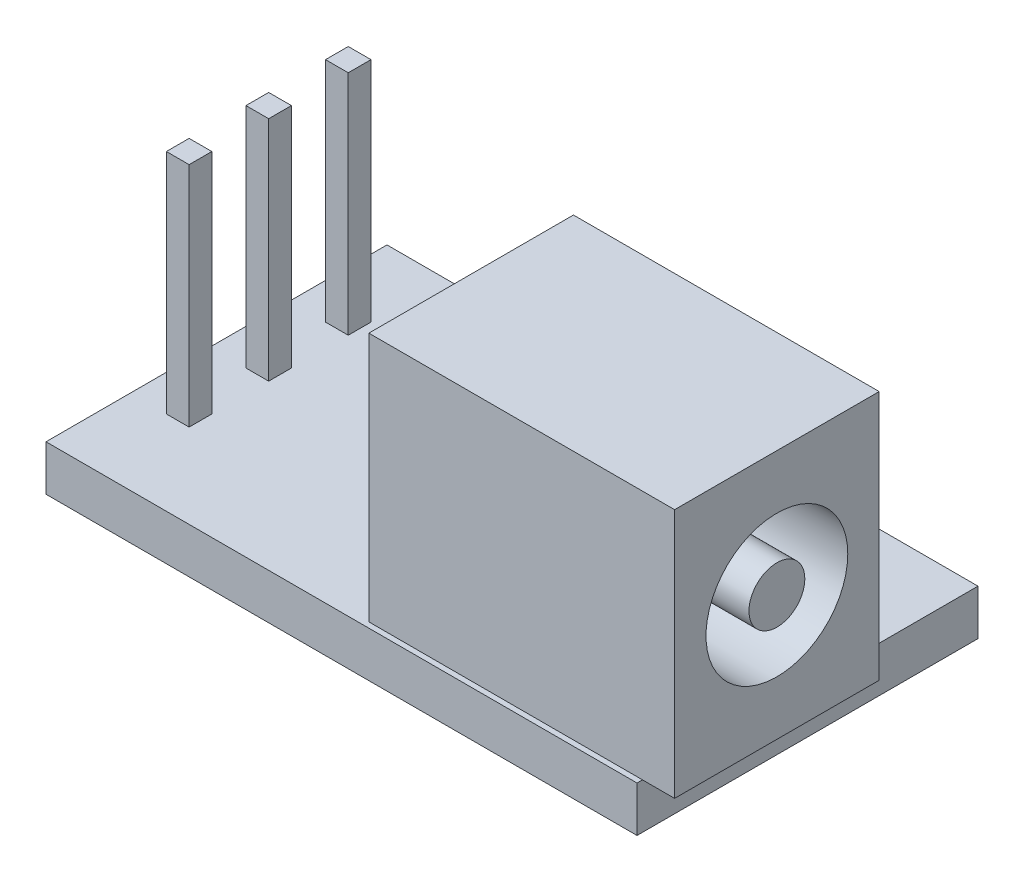
ISO-10303-21;
HEADER;
FILE_DESCRIPTION(('STEP AP214'),'2;1');
FILE_NAME('part.step','',(''),(''),'','','');
FILE_SCHEMA(('AUTOMOTIVE_DESIGN { 1 0 10303 214 1 1 1 1 }'));
ENDSEC;
DATA;
#1=APPLICATION_CONTEXT('core data for automotive mechanical design processes');
#2=APPLICATION_PROTOCOL_DEFINITION('international standard','automotive_design',2000,#1);
#3=PRODUCT_CONTEXT('',#1,'mechanical');
#4=PRODUCT('Part','Part','',(#3));
#5=PRODUCT_RELATED_PRODUCT_CATEGORY('part','',(#4));
#6=PRODUCT_DEFINITION_FORMATION('','',#4);
#7=PRODUCT_DEFINITION_CONTEXT('part definition',#1,'design');
#8=PRODUCT_DEFINITION('design','',#6,#7);
#9=PRODUCT_DEFINITION_SHAPE('','',#8);
#10=(LENGTH_UNIT() NAMED_UNIT(*) SI_UNIT(.MILLI.,.METRE.));
#11=(NAMED_UNIT(*) PLANE_ANGLE_UNIT() SI_UNIT($,.RADIAN.));
#12=(NAMED_UNIT(*) SI_UNIT($,.STERADIAN.) SOLID_ANGLE_UNIT());
#13=UNCERTAINTY_MEASURE_WITH_UNIT(LENGTH_MEASURE(1.E-05),#10,'distance_accuracy_value','');
#14=(GEOMETRIC_REPRESENTATION_CONTEXT(3) GLOBAL_UNCERTAINTY_ASSIGNED_CONTEXT((#13)) GLOBAL_UNIT_ASSIGNED_CONTEXT((#10,
#11,#12)) REPRESENTATION_CONTEXT('',''));
#15=CARTESIAN_POINT('',(0.,0.,0.));
#16=DIRECTION('',(0.,0.,1.));
#17=DIRECTION('',(1.,0.,0.));
#18=AXIS2_PLACEMENT_3D('',#15,#16,#17);
#19=CARTESIAN_POINT('',(0.,2.,0.));
#20=DIRECTION('',(0.,1.,0.));
#21=DIRECTION('',(0.,0.,1.));
#22=AXIS2_PLACEMENT_3D('',#19,#20,#21);
#23=PLANE('',#22);
#24=CARTESIAN_POINT('',(-4.,2.,0.));
#25=DIRECTION('',(0.,1.,0.));
#26=DIRECTION('',(0.,0.,1.));
#27=AXIS2_PLACEMENT_3D('',#24,#25,#26);
#28=CIRCLE('',#27,1.5);
#29=CARTESIAN_POINT('',(-4.,2.,1.5));
#30=VERTEX_POINT('',#29);
#31=EDGE_CURVE('E267',#30,#30,#28,.T.);
#32=ORIENTED_EDGE('',*,*,#31,.F.);
#33=EDGE_LOOP('',(#32));
#34=FACE_BOUND('',#33,.T.);
#35=DIRECTION('',(-1.,0.,0.));
#36=VECTOR('',#35,1.);
#37=CARTESIAN_POINT('',(0.962638708128508,2.,-1.74009974286417));
#38=LINE('',#37,#36);
#39=CARTESIAN_POINT('',(13.,2.,-1.74009974286417));
#40=VERTEX_POINT('',#39);
#41=CARTESIAN_POINT('',(0.962638708128508,2.,-1.74009974286417));
#42=VERTEX_POINT('',#41);
#43=EDGE_CURVE('E11',#40,#42,#38,.T.);
#44=ORIENTED_EDGE('',*,*,#43,.F.);
#45=DIRECTION('',(0.,0.,-1.));
#46=VECTOR('',#45,1.);
#47=CARTESIAN_POINT('',(13.,2.,-7.5));
#48=LINE('',#47,#46);
#49=CARTESIAN_POINT('',(13.,2.,-7.5));
#50=VERTEX_POINT('',#49);
#51=EDGE_CURVE('E306',#40,#50,#48,.T.);
#52=ORIENTED_EDGE('',*,*,#51,.T.);
#53=DIRECTION('',(-1.,0.,0.));
#54=VECTOR('',#53,1.);
#55=CARTESIAN_POINT('',(-13.,2.,-7.5));
#56=LINE('',#55,#54);
#57=CARTESIAN_POINT('',(-13.,2.,-7.5));
#58=VERTEX_POINT('',#57);
#59=EDGE_CURVE('E304',#50,#58,#56,.T.);
#60=ORIENTED_EDGE('',*,*,#59,.T.);
#61=DIRECTION('',(0.,0.,1.));
#62=VECTOR('',#61,1.);
#63=CARTESIAN_POINT('',(-13.,2.,-7.5));
#64=LINE('',#63,#62);
#65=CARTESIAN_POINT('',(-13.,2.,7.5));
#66=VERTEX_POINT('',#65);
#67=EDGE_CURVE('E308',#58,#66,#64,.T.);
#68=ORIENTED_EDGE('',*,*,#67,.T.);
#69=DIRECTION('',(1.,0.,0.));
#70=VECTOR('',#69,1.);
#71=CARTESIAN_POINT('',(-13.,2.,7.5));
#72=LINE('',#71,#70);
#73=CARTESIAN_POINT('',(13.,2.,7.5));
#74=VERTEX_POINT('',#73);
#75=EDGE_CURVE('E310',#66,#74,#72,.T.);
#76=ORIENTED_EDGE('',*,*,#75,.T.);
#77=CARTESIAN_POINT('',(13.,2.,7.25990025713583));
#78=VERTEX_POINT('',#77);
#79=EDGE_CURVE('E302',#74,#78,#48,.T.);
#80=ORIENTED_EDGE('',*,*,#79,.T.);
#81=DIRECTION('',(1.,0.,0.));
#82=VECTOR('',#81,1.);
#83=CARTESIAN_POINT('',(0.962638708128509,2.,7.25990025713583));
#84=LINE('',#83,#82);
#85=CARTESIAN_POINT('',(0.962638708128509,2.,7.25990025713583));
#86=VERTEX_POINT('',#85);
#87=EDGE_CURVE('E284',#86,#78,#84,.T.);
#88=ORIENTED_EDGE('',*,*,#87,.F.);
#89=DIRECTION('',(0.,0.,1.));
#90=VECTOR('',#89,1.);
#91=CARTESIAN_POINT('',(0.962638708128508,2.,-1.74009974286417));
#92=LINE('',#91,#90);
#93=EDGE_CURVE('E280',#42,#86,#92,.T.);
#94=ORIENTED_EDGE('',*,*,#93,.F.);
#95=EDGE_LOOP('',(#44,#52,#60,#68,#76,#80,#88,#94));
#96=FACE_BOUND('',#95,.T.);
#97=DIRECTION('',(1.,0.,0.));
#98=VECTOR('',#97,1.);
#99=CARTESIAN_POINT('',(-11.4105633532802,2.,3.79339200262052));
#100=LINE('',#99,#98);
#101=CARTESIAN_POINT('',(-11.4105633532802,2.,3.79339200262052));
#102=VERTEX_POINT('',#101);
#103=CARTESIAN_POINT('',(-10.4105633532802,2.,3.79339200262052));
#104=VERTEX_POINT('',#103);
#105=EDGE_CURVE('E252',#102,#104,#100,.T.);
#106=ORIENTED_EDGE('',*,*,#105,.F.);
#107=DIRECTION('',(0.,0.,1.));
#108=VECTOR('',#107,1.);
#109=CARTESIAN_POINT('',(-11.4105633532802,2.,3.79339200262052));
#110=LINE('',#109,#108);
#111=CARTESIAN_POINT('',(-11.4105633532802,2.,2.79339200262052));
#112=VERTEX_POINT('',#111);
#113=EDGE_CURVE('E238',#112,#102,#110,.T.);
#114=ORIENTED_EDGE('',*,*,#113,.F.);
#115=DIRECTION('',(-1.,0.,0.));
#116=VECTOR('',#115,1.);
#117=CARTESIAN_POINT('',(-11.4105633532802,2.,2.79339200262052));
#118=LINE('',#117,#116);
#119=CARTESIAN_POINT('',(-10.4105633532802,2.,2.79339200262052));
#120=VERTEX_POINT('',#119);
#121=EDGE_CURVE('E243',#120,#112,#118,.T.);
#122=ORIENTED_EDGE('',*,*,#121,.F.);
#123=DIRECTION('',(0.,0.,-1.));
#124=VECTOR('',#123,1.);
#125=CARTESIAN_POINT('',(-10.4105633532802,2.,3.79339200262052));
#126=LINE('',#125,#124);
#127=EDGE_CURVE('E254',#104,#120,#126,.T.);
#128=ORIENTED_EDGE('',*,*,#127,.F.);
#129=EDGE_LOOP('',(#106,#114,#122,#128));
#130=FACE_BOUND('',#129,.T.);
#131=DIRECTION('',(1.,0.,0.));
#132=VECTOR('',#131,1.);
#133=CARTESIAN_POINT('',(-11.4105633532802,2.,0.293392002620521));
#134=LINE('',#133,#132);
#135=CARTESIAN_POINT('',(-11.4105633532802,2.,0.293392002620521));
#136=VERTEX_POINT('',#135);
#137=CARTESIAN_POINT('',(-10.4105633532802,2.,0.293392002620521));
#138=VERTEX_POINT('',#137);
#139=EDGE_CURVE('E210',#136,#138,#134,.T.);
#140=ORIENTED_EDGE('',*,*,#139,.F.);
#141=DIRECTION('',(0.,0.,1.));
#142=VECTOR('',#141,1.);
#143=CARTESIAN_POINT('',(-11.4105633532802,2.,0.293392002620521));
#144=LINE('',#143,#142);
#145=CARTESIAN_POINT('',(-11.4105633532802,2.,-0.70660799737948));
#146=VERTEX_POINT('',#145);
#147=EDGE_CURVE('E207',#146,#136,#144,.T.);
#148=ORIENTED_EDGE('',*,*,#147,.F.);
#149=DIRECTION('',(-1.,0.,0.));
#150=VECTOR('',#149,1.);
#151=CARTESIAN_POINT('',(-11.4105633532802,2.,-0.70660799737948));
#152=LINE('',#151,#150);
#153=CARTESIAN_POINT('',(-10.4105633532802,2.,-0.70660799737948));
#154=VERTEX_POINT('',#153);
#155=EDGE_CURVE('E219',#154,#146,#152,.T.);
#156=ORIENTED_EDGE('',*,*,#155,.F.);
#157=DIRECTION('',(0.,0.,-1.));
#158=VECTOR('',#157,1.);
#159=CARTESIAN_POINT('',(-10.4105633532802,2.,0.293392002620521));
#160=LINE('',#159,#158);
#161=EDGE_CURVE('E227',#138,#154,#160,.T.);
#162=ORIENTED_EDGE('',*,*,#161,.F.);
#163=EDGE_LOOP('',(#140,#148,#156,#162));
#164=FACE_BOUND('',#163,.T.);
#165=DIRECTION('',(1.,0.,0.));
#166=VECTOR('',#165,1.);
#167=CARTESIAN_POINT('',(-11.4105633532802,2.,-3.20660799737948));
#168=LINE('',#167,#166);
#169=CARTESIAN_POINT('',(-11.4105633532802,2.,-3.20660799737948));
#170=VERTEX_POINT('',#169);
#171=CARTESIAN_POINT('',(-10.4105633532802,2.,-3.20660799737948));
#172=VERTEX_POINT('',#171);
#173=EDGE_CURVE('E651',#170,#172,#168,.T.);
#174=ORIENTED_EDGE('',*,*,#173,.F.);
#175=DIRECTION('',(0.,0.,1.));
#176=VECTOR('',#175,1.);
#177=CARTESIAN_POINT('',(-11.4105633532802,2.,-3.20660799737948));
#178=LINE('',#177,#176);
#179=CARTESIAN_POINT('',(-11.4105633532802,2.,-4.20660799737948));
#180=VERTEX_POINT('',#179);
#181=EDGE_CURVE('E205',#180,#170,#178,.T.);
#182=ORIENTED_EDGE('',*,*,#181,.F.);
#183=DIRECTION('',(-1.,0.,0.));
#184=VECTOR('',#183,1.);
#185=CARTESIAN_POINT('',(-11.4105633532802,2.,-4.20660799737948));
#186=LINE('',#185,#184);
#187=CARTESIAN_POINT('',(-10.4105633532802,2.,-4.20660799737948));
#188=VERTEX_POINT('',#187);
#189=EDGE_CURVE('E201',#188,#180,#186,.T.);
#190=ORIENTED_EDGE('',*,*,#189,.F.);
#191=DIRECTION('',(0.,0.,-1.));
#192=VECTOR('',#191,1.);
#193=CARTESIAN_POINT('',(-10.4105633532802,2.,-3.20660799737948));
#194=LINE('',#193,#192);
#195=EDGE_CURVE('E653',#172,#188,#194,.T.);
#196=ORIENTED_EDGE('',*,*,#195,.F.);
#197=EDGE_LOOP('',(#174,#182,#190,#196));
#198=FACE_BOUND('',#197,.T.);
#199=ADVANCED_FACE('F35',(#34,#96,#130,#164,#198),#23,.T.);
#200=CARTESIAN_POINT('',(13.,2.,-7.5));
#201=DIRECTION('',(-1.,0.,0.));
#202=DIRECTION('',(0.,0.,1.));
#203=AXIS2_PLACEMENT_3D('',#200,#201,#202);
#204=PLANE('',#203);
#205=DIRECTION('',(0.,0.,-1.));
#206=VECTOR('',#205,1.);
#207=CARTESIAN_POINT('',(13.,0.,-7.5));
#208=LINE('',#207,#206);
#209=CARTESIAN_POINT('',(13.,0.,7.5));
#210=VERTEX_POINT('',#209);
#211=CARTESIAN_POINT('',(13.,0.,-7.5));
#212=VERTEX_POINT('',#211);
#213=EDGE_CURVE('E301',#210,#212,#208,.T.);
#214=ORIENTED_EDGE('',*,*,#213,.T.);
#215=DIRECTION('',(0.,-1.,0.));
#216=VECTOR('',#215,1.);
#217=CARTESIAN_POINT('',(13.,2.,-7.5));
#218=LINE('',#217,#216);
#219=EDGE_CURVE('E44',#50,#212,#218,.T.);
#220=ORIENTED_EDGE('',*,*,#219,.F.);
#221=ORIENTED_EDGE('',*,*,#51,.F.);
#222=EDGE_CURVE('E305',#78,#40,#48,.T.);
#223=ORIENTED_EDGE('',*,*,#222,.F.);
#224=ORIENTED_EDGE('',*,*,#79,.F.);
#225=DIRECTION('',(0.,-1.,0.));
#226=VECTOR('',#225,1.);
#227=CARTESIAN_POINT('',(13.,2.,7.5));
#228=LINE('',#227,#226);
#229=EDGE_CURVE('E312',#74,#210,#228,.T.);
#230=ORIENTED_EDGE('',*,*,#229,.T.);
#231=EDGE_LOOP('',(#214,#220,#221,#223,#224,#230));
#232=FACE_BOUND('',#231,.T.);
#233=ADVANCED_FACE('F37',(#232),#204,.F.);
#234=CARTESIAN_POINT('',(-13.,2.,-7.5));
#235=DIRECTION('',(0.,0.,1.));
#236=DIRECTION('',(1.,0.,0.));
#237=AXIS2_PLACEMENT_3D('',#234,#235,#236);
#238=PLANE('',#237);
#239=DIRECTION('',(-1.,0.,0.));
#240=VECTOR('',#239,1.);
#241=CARTESIAN_POINT('',(-13.,0.,-7.5));
#242=LINE('',#241,#240);
#243=CARTESIAN_POINT('',(-13.,0.,-7.5));
#244=VERTEX_POINT('',#243);
#245=EDGE_CURVE('E315',#212,#244,#242,.T.);
#246=ORIENTED_EDGE('',*,*,#245,.T.);
#247=DIRECTION('',(0.,-1.,0.));
#248=VECTOR('',#247,1.);
#249=CARTESIAN_POINT('',(-13.,2.,-7.5));
#250=LINE('',#249,#248);
#251=EDGE_CURVE('E326',#58,#244,#250,.T.);
#252=ORIENTED_EDGE('',*,*,#251,.F.);
#253=ORIENTED_EDGE('',*,*,#59,.F.);
#254=ORIENTED_EDGE('',*,*,#219,.T.);
#255=EDGE_LOOP('',(#246,#252,#253,#254));
#256=FACE_BOUND('',#255,.T.);
#257=ADVANCED_FACE('F332',(#256),#238,.F.);
#258=CARTESIAN_POINT('',(-13.,2.,-7.5));
#259=DIRECTION('',(1.,0.,0.));
#260=DIRECTION('',(0.,0.,-1.));
#261=AXIS2_PLACEMENT_3D('',#258,#259,#260);
#262=PLANE('',#261);
#263=DIRECTION('',(0.,0.,1.));
#264=VECTOR('',#263,1.);
#265=CARTESIAN_POINT('',(-13.,0.,-7.5));
#266=LINE('',#265,#264);
#267=CARTESIAN_POINT('',(-13.,0.,7.5));
#268=VERTEX_POINT('',#267);
#269=EDGE_CURVE('E317',#244,#268,#266,.T.);
#270=ORIENTED_EDGE('',*,*,#269,.T.);
#271=DIRECTION('',(0.,-1.,0.));
#272=VECTOR('',#271,1.);
#273=CARTESIAN_POINT('',(-13.,2.,7.5));
#274=LINE('',#273,#272);
#275=EDGE_CURVE('E323',#66,#268,#274,.T.);
#276=ORIENTED_EDGE('',*,*,#275,.F.);
#277=ORIENTED_EDGE('',*,*,#67,.F.);
#278=ORIENTED_EDGE('',*,*,#251,.T.);
#279=EDGE_LOOP('',(#270,#276,#277,#278));
#280=FACE_BOUND('',#279,.T.);
#281=ADVANCED_FACE('F345',(#280),#262,.F.);
#282=CARTESIAN_POINT('',(-13.,2.,7.5));
#283=DIRECTION('',(0.,0.,-1.));
#284=DIRECTION('',(-1.,0.,0.));
#285=AXIS2_PLACEMENT_3D('',#282,#283,#284);
#286=PLANE('',#285);
#287=DIRECTION('',(1.,0.,0.));
#288=VECTOR('',#287,1.);
#289=CARTESIAN_POINT('',(-13.,0.,7.5));
#290=LINE('',#289,#288);
#291=EDGE_CURVE('E319',#268,#210,#290,.T.);
#292=ORIENTED_EDGE('',*,*,#291,.T.);
#293=ORIENTED_EDGE('',*,*,#229,.F.);
#294=ORIENTED_EDGE('',*,*,#75,.F.);
#295=ORIENTED_EDGE('',*,*,#275,.T.);
#296=EDGE_LOOP('',(#292,#293,#294,#295));
#297=FACE_BOUND('',#296,.T.);
#298=ADVANCED_FACE('F349',(#297),#286,.F.);
#299=CARTESIAN_POINT('',(0.,0.,0.));
#300=DIRECTION('',(0.,1.,0.));
#301=DIRECTION('',(0.,0.,1.));
#302=AXIS2_PLACEMENT_3D('',#299,#300,#301);
#303=PLANE('',#302);
#304=CARTESIAN_POINT('',(-4.,0.,0.));
#305=DIRECTION('',(0.,1.,0.));
#306=DIRECTION('',(0.,0.,1.));
#307=AXIS2_PLACEMENT_3D('',#304,#305,#306);
#308=CIRCLE('',#307,1.5);
#309=CARTESIAN_POINT('',(-4.,0.,1.5));
#310=VERTEX_POINT('',#309);
#311=EDGE_CURVE('E39',#310,#310,#308,.T.);
#312=ORIENTED_EDGE('',*,*,#311,.T.);
#313=EDGE_LOOP('',(#312));
#314=FACE_BOUND('',#313,.T.);
#315=ORIENTED_EDGE('',*,*,#213,.F.);
#316=ORIENTED_EDGE('',*,*,#291,.F.);
#317=ORIENTED_EDGE('',*,*,#269,.F.);
#318=ORIENTED_EDGE('',*,*,#245,.F.);
#319=EDGE_LOOP('',(#315,#316,#317,#318));
#320=FACE_BOUND('',#319,.T.);
#321=ADVANCED_FACE('F341',(#314,#320),#303,.F.);
#322=CARTESIAN_POINT('',(0.,2.,0.));
#323=DIRECTION('',(0.,1.,0.));
#324=DIRECTION('',(0.,0.,1.));
#325=AXIS2_PLACEMENT_3D('',#322,#323,#324);
#326=PLANE('',#325);
#327=CARTESIAN_POINT('',(14.4128406578129,2.,7.25990025713583));
#328=VERTEX_POINT('',#327);
#329=EDGE_CURVE('E283',#78,#328,#84,.T.);
#330=ORIENTED_EDGE('',*,*,#329,.F.);
#331=ORIENTED_EDGE('',*,*,#222,.T.);
#332=CARTESIAN_POINT('',(14.4128406578129,2.,-1.74009974286417));
#333=VERTEX_POINT('',#332);
#334=EDGE_CURVE('E46',#333,#40,#38,.T.);
#335=ORIENTED_EDGE('',*,*,#334,.F.);
#336=DIRECTION('',(0.,0.,-1.));
#337=VECTOR('',#336,1.);
#338=CARTESIAN_POINT('',(14.4128406578129,2.,-1.74009974286417));
#339=LINE('',#338,#337);
#340=EDGE_CURVE('E287',#328,#333,#339,.T.);
#341=ORIENTED_EDGE('',*,*,#340,.F.);
#342=EDGE_LOOP('',(#330,#331,#335,#341));
#343=FACE_BOUND('',#342,.T.);
#344=ADVANCED_FACE('F357',(#343),#326,.F.);
#345=CARTESIAN_POINT('',(0.962638708128508,13.,-1.74009974286417));
#346=DIRECTION('',(1.,0.,0.));
#347=DIRECTION('',(0.,0.,-1.));
#348=AXIS2_PLACEMENT_3D('',#345,#346,#347);
#349=PLANE('',#348);
#350=ORIENTED_EDGE('',*,*,#93,.T.);
#351=DIRECTION('',(0.,-1.,0.));
#352=VECTOR('',#351,1.);
#353=CARTESIAN_POINT('',(0.962638708128509,13.,7.25990025713583));
#354=LINE('',#353,#352);
#355=CARTESIAN_POINT('',(0.962638708128509,13.,7.25990025713583));
#356=VERTEX_POINT('',#355);
#357=EDGE_CURVE('E298',#356,#86,#354,.T.);
#358=ORIENTED_EDGE('',*,*,#357,.F.);
#359=DIRECTION('',(0.,0.,1.));
#360=VECTOR('',#359,1.);
#361=CARTESIAN_POINT('',(0.962638708128508,13.,-1.74009974286417));
#362=LINE('',#361,#360);
#363=CARTESIAN_POINT('',(0.962638708128508,13.,-1.74009974286417));
#364=VERTEX_POINT('',#363);
#365=EDGE_CURVE('E270',#364,#356,#362,.T.);
#366=ORIENTED_EDGE('',*,*,#365,.F.);
#367=DIRECTION('',(0.,-1.,0.));
#368=VECTOR('',#367,1.);
#369=CARTESIAN_POINT('',(0.962638708128508,13.,-1.74009974286417));
#370=LINE('',#369,#368);
#371=EDGE_CURVE('E279',#364,#42,#370,.T.);
#372=ORIENTED_EDGE('',*,*,#371,.T.);
#373=EDGE_LOOP('',(#350,#358,#366,#372));
#374=FACE_BOUND('',#373,.T.);
#375=ADVANCED_FACE('F372',(#374),#349,.F.);
#376=CARTESIAN_POINT('',(0.962638708128509,13.,7.25990025713583));
#377=DIRECTION('',(0.,0.,-1.));
#378=DIRECTION('',(-1.,0.,0.));
#379=AXIS2_PLACEMENT_3D('',#376,#377,#378);
#380=PLANE('',#379);
#381=ORIENTED_EDGE('',*,*,#87,.T.);
#382=ORIENTED_EDGE('',*,*,#329,.T.);
#383=DIRECTION('',(0.,-1.,0.));
#384=VECTOR('',#383,1.);
#385=CARTESIAN_POINT('',(14.4128406578129,13.,7.25990025713583));
#386=LINE('',#385,#384);
#387=CARTESIAN_POINT('',(14.4128406578129,13.,7.25990025713583));
#388=VERTEX_POINT('',#387);
#389=EDGE_CURVE('E295',#388,#328,#386,.T.);
#390=ORIENTED_EDGE('',*,*,#389,.F.);
#391=DIRECTION('',(1.,0.,0.));
#392=VECTOR('',#391,1.);
#393=CARTESIAN_POINT('',(0.962638708128509,13.,7.25990025713583));
#394=LINE('',#393,#392);
#395=EDGE_CURVE('E273',#356,#388,#394,.T.);
#396=ORIENTED_EDGE('',*,*,#395,.F.);
#397=ORIENTED_EDGE('',*,*,#357,.T.);
#398=EDGE_LOOP('',(#381,#382,#390,#396,#397));
#399=FACE_BOUND('',#398,.T.);
#400=ADVANCED_FACE('F369',(#399),#380,.F.);
#401=CARTESIAN_POINT('',(14.4128406578129,13.,-1.74009974286417));
#402=DIRECTION('',(-1.,0.,0.));
#403=DIRECTION('',(0.,0.,1.));
#404=AXIS2_PLACEMENT_3D('',#401,#402,#403);
#405=PLANE('',#404);
#406=CARTESIAN_POINT('',(14.4128406578129,7.5,2.75990025713583));
#407=DIRECTION('',(1.,0.,0.));
#408=DIRECTION('',(0.,0.,-1.));
#409=AXIS2_PLACEMENT_3D('',#406,#407,#408);
#410=CIRCLE('',#409,3.11835521317221);
#411=CARTESIAN_POINT('',(14.4128406578129,7.5,-0.35845495603638));
#412=VERTEX_POINT('',#411);
#413=EDGE_CURVE('E639',#412,#412,#410,.T.);
#414=ORIENTED_EDGE('',*,*,#413,.F.);
#415=EDGE_LOOP('',(#414));
#416=FACE_BOUND('',#415,.T.);
#417=ORIENTED_EDGE('',*,*,#340,.T.);
#418=DIRECTION('',(0.,-1.,0.));
#419=VECTOR('',#418,1.);
#420=CARTESIAN_POINT('',(14.4128406578129,13.,-1.74009974286417));
#421=LINE('',#420,#419);
#422=CARTESIAN_POINT('',(14.4128406578129,13.,-1.74009974286417));
#423=VERTEX_POINT('',#422);
#424=EDGE_CURVE('E292',#423,#333,#421,.T.);
#425=ORIENTED_EDGE('',*,*,#424,.F.);
#426=DIRECTION('',(0.,0.,-1.));
#427=VECTOR('',#426,1.);
#428=CARTESIAN_POINT('',(14.4128406578129,13.,-1.74009974286417));
#429=LINE('',#428,#427);
#430=EDGE_CURVE('E275',#388,#423,#429,.T.);
#431=ORIENTED_EDGE('',*,*,#430,.F.);
#432=ORIENTED_EDGE('',*,*,#389,.T.);
#433=EDGE_LOOP('',(#417,#425,#431,#432));
#434=FACE_BOUND('',#433,.T.);
#435=ADVANCED_FACE('F366',(#416,#434),#405,.F.);
#436=CARTESIAN_POINT('',(0.962638708128508,13.,-1.74009974286417));
#437=DIRECTION('',(0.,0.,1.));
#438=DIRECTION('',(1.,0.,0.));
#439=AXIS2_PLACEMENT_3D('',#436,#437,#438);
#440=PLANE('',#439);
#441=ORIENTED_EDGE('',*,*,#334,.T.);
#442=ORIENTED_EDGE('',*,*,#43,.T.);
#443=ORIENTED_EDGE('',*,*,#371,.F.);
#444=DIRECTION('',(-1.,0.,0.));
#445=VECTOR('',#444,1.);
#446=CARTESIAN_POINT('',(0.962638708128508,13.,-1.74009974286417));
#447=LINE('',#446,#445);
#448=EDGE_CURVE('E277',#423,#364,#447,.T.);
#449=ORIENTED_EDGE('',*,*,#448,.F.);
#450=ORIENTED_EDGE('',*,*,#424,.T.);
#451=EDGE_LOOP('',(#441,#442,#443,#449,#450));
#452=FACE_BOUND('',#451,.T.);
#453=ADVANCED_FACE('F360',(#452),#440,.F.);
#454=CARTESIAN_POINT('',(0.,13.,0.));
#455=DIRECTION('',(0.,1.,0.));
#456=DIRECTION('',(0.,0.,1.));
#457=AXIS2_PLACEMENT_3D('',#454,#455,#456);
#458=PLANE('',#457);
#459=ORIENTED_EDGE('',*,*,#365,.T.);
#460=ORIENTED_EDGE('',*,*,#395,.T.);
#461=ORIENTED_EDGE('',*,*,#430,.T.);
#462=ORIENTED_EDGE('',*,*,#448,.T.);
#463=EDGE_LOOP('',(#459,#460,#461,#462));
#464=FACE_BOUND('',#463,.T.);
#465=ADVANCED_FACE('F375',(#464),#458,.T.);
#466=CARTESIAN_POINT('',(-4.,-9.,0.));
#467=DIRECTION('',(0.,1.,0.));
#468=DIRECTION('',(0.,0.,1.));
#469=AXIS2_PLACEMENT_3D('',#466,#467,#468);
#470=CYLINDRICAL_SURFACE('',#469,1.5);
#471=ORIENTED_EDGE('',*,*,#31,.T.);
#472=EDGE_LOOP('',(#471));
#473=FACE_BOUND('',#472,.T.);
#474=ORIENTED_EDGE('',*,*,#311,.F.);
#475=EDGE_LOOP('',(#474));
#476=FACE_BOUND('',#475,.T.);
#477=ADVANCED_FACE('F377',(#473,#476),#470,.F.);
#478=CARTESIAN_POINT('',(-11.4105633532802,12.,3.79339200262052));
#479=DIRECTION('',(1.,0.,0.));
#480=DIRECTION('',(0.,0.,-1.));
#481=AXIS2_PLACEMENT_3D('',#478,#479,#480);
#482=PLANE('',#481);
#483=ORIENTED_EDGE('',*,*,#113,.T.);
#484=DIRECTION('',(0.,-1.,0.));
#485=VECTOR('',#484,1.);
#486=CARTESIAN_POINT('',(-11.4105633532802,12.,3.79339200262052));
#487=LINE('',#486,#485);
#488=CARTESIAN_POINT('',(-11.4105633532802,12.,3.79339200262052));
#489=VERTEX_POINT('',#488);
#490=EDGE_CURVE('E265',#489,#102,#487,.T.);
#491=ORIENTED_EDGE('',*,*,#490,.F.);
#492=DIRECTION('',(0.,0.,1.));
#493=VECTOR('',#492,1.);
#494=CARTESIAN_POINT('',(-11.4105633532802,12.,3.79339200262052));
#495=LINE('',#494,#493);
#496=CARTESIAN_POINT('',(-11.4105633532802,12.,2.79339200262052));
#497=VERTEX_POINT('',#496);
#498=EDGE_CURVE('E239',#497,#489,#495,.T.);
#499=ORIENTED_EDGE('',*,*,#498,.F.);
#500=DIRECTION('',(0.,-1.,0.));
#501=VECTOR('',#500,1.);
#502=CARTESIAN_POINT('',(-11.4105633532802,12.,2.79339200262052));
#503=LINE('',#502,#501);
#504=EDGE_CURVE('E249',#497,#112,#503,.T.);
#505=ORIENTED_EDGE('',*,*,#504,.T.);
#506=EDGE_LOOP('',(#483,#491,#499,#505));
#507=FACE_BOUND('',#506,.T.);
#508=ADVANCED_FACE('F383',(#507),#482,.F.);
#509=CARTESIAN_POINT('',(-11.4105633532802,12.,3.79339200262052));
#510=DIRECTION('',(0.,0.,-1.));
#511=DIRECTION('',(-1.,0.,0.));
#512=AXIS2_PLACEMENT_3D('',#509,#510,#511);
#513=PLANE('',#512);
#514=ORIENTED_EDGE('',*,*,#105,.T.);
#515=DIRECTION('',(0.,-1.,0.));
#516=VECTOR('',#515,1.);
#517=CARTESIAN_POINT('',(-10.4105633532802,12.,3.79339200262052));
#518=LINE('',#517,#516);
#519=CARTESIAN_POINT('',(-10.4105633532802,12.,3.79339200262052));
#520=VERTEX_POINT('',#519);
#521=EDGE_CURVE('E262',#520,#104,#518,.T.);
#522=ORIENTED_EDGE('',*,*,#521,.F.);
#523=DIRECTION('',(1.,0.,0.));
#524=VECTOR('',#523,1.);
#525=CARTESIAN_POINT('',(-11.4105633532802,12.,3.79339200262052));
#526=LINE('',#525,#524);
#527=EDGE_CURVE('E242',#489,#520,#526,.T.);
#528=ORIENTED_EDGE('',*,*,#527,.F.);
#529=ORIENTED_EDGE('',*,*,#490,.T.);
#530=EDGE_LOOP('',(#514,#522,#528,#529));
#531=FACE_BOUND('',#530,.T.);
#532=ADVANCED_FACE('F475',(#531),#513,.F.);
#533=CARTESIAN_POINT('',(-10.4105633532802,12.,3.79339200262052));
#534=DIRECTION('',(-1.,0.,0.));
#535=DIRECTION('',(0.,0.,1.));
#536=AXIS2_PLACEMENT_3D('',#533,#534,#535);
#537=PLANE('',#536);
#538=ORIENTED_EDGE('',*,*,#127,.T.);
#539=DIRECTION('',(0.,-1.,0.));
#540=VECTOR('',#539,1.);
#541=CARTESIAN_POINT('',(-10.4105633532802,12.,2.79339200262052));
#542=LINE('',#541,#540);
#543=CARTESIAN_POINT('',(-10.4105633532802,12.,2.79339200262052));
#544=VERTEX_POINT('',#543);
#545=EDGE_CURVE('E260',#544,#120,#542,.T.);
#546=ORIENTED_EDGE('',*,*,#545,.F.);
#547=DIRECTION('',(0.,0.,-1.));
#548=VECTOR('',#547,1.);
#549=CARTESIAN_POINT('',(-10.4105633532802,12.,3.79339200262052));
#550=LINE('',#549,#548);
#551=EDGE_CURVE('E245',#520,#544,#550,.T.);
#552=ORIENTED_EDGE('',*,*,#551,.F.);
#553=ORIENTED_EDGE('',*,*,#521,.T.);
#554=EDGE_LOOP('',(#538,#546,#552,#553));
#555=FACE_BOUND('',#554,.T.);
#556=ADVANCED_FACE('F484',(#555),#537,.F.);
#557=CARTESIAN_POINT('',(-11.4105633532802,12.,2.79339200262052));
#558=DIRECTION('',(0.,0.,1.));
#559=DIRECTION('',(1.,0.,0.));
#560=AXIS2_PLACEMENT_3D('',#557,#558,#559);
#561=PLANE('',#560);
#562=ORIENTED_EDGE('',*,*,#121,.T.);
#563=ORIENTED_EDGE('',*,*,#504,.F.);
#564=DIRECTION('',(-1.,0.,0.));
#565=VECTOR('',#564,1.);
#566=CARTESIAN_POINT('',(-11.4105633532802,12.,2.79339200262052));
#567=LINE('',#566,#565);
#568=EDGE_CURVE('E247',#544,#497,#567,.T.);
#569=ORIENTED_EDGE('',*,*,#568,.F.);
#570=ORIENTED_EDGE('',*,*,#545,.T.);
#571=EDGE_LOOP('',(#562,#563,#569,#570));
#572=FACE_BOUND('',#571,.T.);
#573=ADVANCED_FACE('F493',(#572),#561,.F.);
#574=CARTESIAN_POINT('',(0.,12.,0.));
#575=DIRECTION('',(0.,-1.,0.));
#576=DIRECTION('',(0.,0.,-1.));
#577=AXIS2_PLACEMENT_3D('',#574,#575,#576);
#578=PLANE('',#577);
#579=ORIENTED_EDGE('',*,*,#498,.T.);
#580=ORIENTED_EDGE('',*,*,#527,.T.);
#581=ORIENTED_EDGE('',*,*,#551,.T.);
#582=ORIENTED_EDGE('',*,*,#568,.T.);
#583=EDGE_LOOP('',(#579,#580,#581,#582));
#584=FACE_BOUND('',#583,.T.);
#585=ADVANCED_FACE('F502',(#584),#578,.F.);
#586=CARTESIAN_POINT('',(-11.4105633532802,12.,0.293392002620521));
#587=DIRECTION('',(1.,0.,0.));
#588=DIRECTION('',(0.,0.,-1.));
#589=AXIS2_PLACEMENT_3D('',#586,#587,#588);
#590=PLANE('',#589);
#591=ORIENTED_EDGE('',*,*,#147,.T.);
#592=DIRECTION('',(0.,-1.,0.));
#593=VECTOR('',#592,1.);
#594=CARTESIAN_POINT('',(-11.4105633532802,12.,0.293392002620521));
#595=LINE('',#594,#593);
#596=CARTESIAN_POINT('',(-11.4105633532802,12.,0.293392002620521));
#597=VERTEX_POINT('',#596);
#598=EDGE_CURVE('E236',#597,#136,#595,.T.);
#599=ORIENTED_EDGE('',*,*,#598,.F.);
#600=DIRECTION('',(0.,0.,1.));
#601=VECTOR('',#600,1.);
#602=CARTESIAN_POINT('',(-11.4105633532802,12.,0.293392002620521));
#603=LINE('',#602,#601);
#604=CARTESIAN_POINT('',(-11.4105633532802,12.,-0.70660799737948));
#605=VERTEX_POINT('',#604);
#606=EDGE_CURVE('E215',#605,#597,#603,.T.);
#607=ORIENTED_EDGE('',*,*,#606,.F.);
#608=DIRECTION('',(0.,-1.,0.));
#609=VECTOR('',#608,1.);
#610=CARTESIAN_POINT('',(-11.4105633532802,12.,-0.70660799737948));
#611=LINE('',#610,#609);
#612=EDGE_CURVE('E224',#605,#146,#611,.T.);
#613=ORIENTED_EDGE('',*,*,#612,.T.);
#614=EDGE_LOOP('',(#591,#599,#607,#613));
#615=FACE_BOUND('',#614,.T.);
#616=ADVANCED_FACE('F511',(#615),#590,.F.);
#617=CARTESIAN_POINT('',(-11.4105633532802,12.,0.293392002620521));
#618=DIRECTION('',(0.,0.,-1.));
#619=DIRECTION('',(-1.,0.,0.));
#620=AXIS2_PLACEMENT_3D('',#617,#618,#619);
#621=PLANE('',#620);
#622=ORIENTED_EDGE('',*,*,#139,.T.);
#623=DIRECTION('',(0.,-1.,0.));
#624=VECTOR('',#623,1.);
#625=CARTESIAN_POINT('',(-10.4105633532802,12.,0.293392002620521));
#626=LINE('',#625,#624);
#627=CARTESIAN_POINT('',(-10.4105633532802,12.,0.293392002620521));
#628=VERTEX_POINT('',#627);
#629=EDGE_CURVE('E233',#628,#138,#626,.T.);
#630=ORIENTED_EDGE('',*,*,#629,.F.);
#631=DIRECTION('',(1.,0.,0.));
#632=VECTOR('',#631,1.);
#633=CARTESIAN_POINT('',(-11.4105633532802,12.,0.293392002620521));
#634=LINE('',#633,#632);
#635=EDGE_CURVE('E218',#597,#628,#634,.T.);
#636=ORIENTED_EDGE('',*,*,#635,.F.);
#637=ORIENTED_EDGE('',*,*,#598,.T.);
#638=EDGE_LOOP('',(#622,#630,#636,#637));
#639=FACE_BOUND('',#638,.T.);
#640=ADVANCED_FACE('F520',(#639),#621,.F.);
#641=CARTESIAN_POINT('',(-10.4105633532802,12.,0.293392002620521));
#642=DIRECTION('',(-1.,0.,0.));
#643=DIRECTION('',(0.,0.,1.));
#644=AXIS2_PLACEMENT_3D('',#641,#642,#643);
#645=PLANE('',#644);
#646=ORIENTED_EDGE('',*,*,#161,.T.);
#647=DIRECTION('',(0.,-1.,0.));
#648=VECTOR('',#647,1.);
#649=CARTESIAN_POINT('',(-10.4105633532802,12.,-0.70660799737948));
#650=LINE('',#649,#648);
#651=CARTESIAN_POINT('',(-10.4105633532802,12.,-0.70660799737948));
#652=VERTEX_POINT('',#651);
#653=EDGE_CURVE('E61',#652,#154,#650,.T.);
#654=ORIENTED_EDGE('',*,*,#653,.F.);
#655=DIRECTION('',(0.,0.,-1.));
#656=VECTOR('',#655,1.);
#657=CARTESIAN_POINT('',(-10.4105633532802,12.,0.293392002620521));
#658=LINE('',#657,#656);
#659=EDGE_CURVE('E221',#628,#652,#658,.T.);
#660=ORIENTED_EDGE('',*,*,#659,.F.);
#661=ORIENTED_EDGE('',*,*,#629,.T.);
#662=EDGE_LOOP('',(#646,#654,#660,#661));
#663=FACE_BOUND('',#662,.T.);
#664=ADVANCED_FACE('F529',(#663),#645,.F.);
#665=CARTESIAN_POINT('',(-11.4105633532802,12.,-0.70660799737948));
#666=DIRECTION('',(0.,0.,1.));
#667=DIRECTION('',(1.,0.,0.));
#668=AXIS2_PLACEMENT_3D('',#665,#666,#667);
#669=PLANE('',#668);
#670=ORIENTED_EDGE('',*,*,#155,.T.);
#671=ORIENTED_EDGE('',*,*,#612,.F.);
#672=DIRECTION('',(-1.,0.,0.));
#673=VECTOR('',#672,1.);
#674=CARTESIAN_POINT('',(-11.4105633532802,12.,-0.70660799737948));
#675=LINE('',#674,#673);
#676=EDGE_CURVE('E223',#652,#605,#675,.T.);
#677=ORIENTED_EDGE('',*,*,#676,.F.);
#678=ORIENTED_EDGE('',*,*,#653,.T.);
#679=EDGE_LOOP('',(#670,#671,#677,#678));
#680=FACE_BOUND('',#679,.T.);
#681=ADVANCED_FACE('F538',(#680),#669,.F.);
#682=CARTESIAN_POINT('',(0.,12.,0.));
#683=DIRECTION('',(0.,-1.,0.));
#684=DIRECTION('',(0.,0.,-1.));
#685=AXIS2_PLACEMENT_3D('',#682,#683,#684);
#686=PLANE('',#685);
#687=ORIENTED_EDGE('',*,*,#606,.T.);
#688=ORIENTED_EDGE('',*,*,#635,.T.);
#689=ORIENTED_EDGE('',*,*,#659,.T.);
#690=ORIENTED_EDGE('',*,*,#676,.T.);
#691=EDGE_LOOP('',(#687,#688,#689,#690));
#692=FACE_BOUND('',#691,.T.);
#693=ADVANCED_FACE('F547',(#692),#686,.F.);
#694=CARTESIAN_POINT('',(-11.4105633532802,12.,-3.20660799737948));
#695=DIRECTION('',(1.,0.,0.));
#696=DIRECTION('',(0.,0.,-1.));
#697=AXIS2_PLACEMENT_3D('',#694,#695,#696);
#698=PLANE('',#697);
#699=ORIENTED_EDGE('',*,*,#181,.T.);
#700=DIRECTION('',(0.,-1.,0.));
#701=VECTOR('',#700,1.);
#702=CARTESIAN_POINT('',(-11.4105633532802,12.,-3.20660799737948));
#703=LINE('',#702,#701);
#704=CARTESIAN_POINT('',(-11.4105633532802,12.,-3.20660799737948));
#705=VERTEX_POINT('',#704);
#706=EDGE_CURVE('E186',#705,#170,#703,.T.);
#707=ORIENTED_EDGE('',*,*,#706,.F.);
#708=DIRECTION('',(0.,0.,1.));
#709=VECTOR('',#708,1.);
#710=CARTESIAN_POINT('',(-11.4105633532802,12.,-3.20660799737948));
#711=LINE('',#710,#709);
#712=CARTESIAN_POINT('',(-11.4105633532802,12.,-4.20660799737948));
#713=VERTEX_POINT('',#712);
#714=EDGE_CURVE('E193',#713,#705,#711,.T.);
#715=ORIENTED_EDGE('',*,*,#714,.F.);
#716=DIRECTION('',(0.,-1.,0.));
#717=VECTOR('',#716,1.);
#718=CARTESIAN_POINT('',(-11.4105633532802,12.,-4.20660799737948));
#719=LINE('',#718,#717);
#720=EDGE_CURVE('E649',#713,#180,#719,.T.);
#721=ORIENTED_EDGE('',*,*,#720,.T.);
#722=EDGE_LOOP('',(#699,#707,#715,#721));
#723=FACE_BOUND('',#722,.T.);
#724=ADVANCED_FACE('F203',(#723),#698,.F.);
#725=CARTESIAN_POINT('',(-11.4105633532802,12.,-3.20660799737948));
#726=DIRECTION('',(0.,0.,-1.));
#727=DIRECTION('',(-1.,0.,0.));
#728=AXIS2_PLACEMENT_3D('',#725,#726,#727);
#729=PLANE('',#728);
#730=ORIENTED_EDGE('',*,*,#173,.T.);
#731=DIRECTION('',(0.,-1.,0.));
#732=VECTOR('',#731,1.);
#733=CARTESIAN_POINT('',(-10.4105633532802,12.,-3.20660799737948));
#734=LINE('',#733,#732);
#735=CARTESIAN_POINT('',(-10.4105633532802,12.,-3.20660799737948));
#736=VERTEX_POINT('',#735);
#737=EDGE_CURVE('E189',#736,#172,#734,.T.);
#738=ORIENTED_EDGE('',*,*,#737,.F.);
#739=DIRECTION('',(1.,0.,0.));
#740=VECTOR('',#739,1.);
#741=CARTESIAN_POINT('',(-11.4105633532802,12.,-3.20660799737948));
#742=LINE('',#741,#740);
#743=EDGE_CURVE('E182',#705,#736,#742,.T.);
#744=ORIENTED_EDGE('',*,*,#743,.F.);
#745=ORIENTED_EDGE('',*,*,#706,.T.);
#746=EDGE_LOOP('',(#730,#738,#744,#745));
#747=FACE_BOUND('',#746,.T.);
#748=ADVANCED_FACE('F184',(#747),#729,.F.);
#749=CARTESIAN_POINT('',(-10.4105633532802,12.,-3.20660799737948));
#750=DIRECTION('',(-1.,0.,0.));
#751=DIRECTION('',(0.,0.,1.));
#752=AXIS2_PLACEMENT_3D('',#749,#750,#751);
#753=PLANE('',#752);
#754=ORIENTED_EDGE('',*,*,#195,.T.);
#755=DIRECTION('',(0.,-1.,0.));
#756=VECTOR('',#755,1.);
#757=CARTESIAN_POINT('',(-10.4105633532802,12.,-4.20660799737948));
#758=LINE('',#757,#756);
#759=CARTESIAN_POINT('',(-10.4105633532802,12.,-4.20660799737948));
#760=VERTEX_POINT('',#759);
#761=EDGE_CURVE('E53',#760,#188,#758,.T.);
#762=ORIENTED_EDGE('',*,*,#761,.F.);
#763=DIRECTION('',(0.,0.,-1.));
#764=VECTOR('',#763,1.);
#765=CARTESIAN_POINT('',(-10.4105633532802,12.,-3.20660799737948));
#766=LINE('',#765,#764);
#767=EDGE_CURVE('E192',#736,#760,#766,.T.);
#768=ORIENTED_EDGE('',*,*,#767,.F.);
#769=ORIENTED_EDGE('',*,*,#737,.T.);
#770=EDGE_LOOP('',(#754,#762,#768,#769));
#771=FACE_BOUND('',#770,.T.);
#772=ADVANCED_FACE('F570',(#771),#753,.F.);
#773=CARTESIAN_POINT('',(-11.4105633532802,12.,-4.20660799737948));
#774=DIRECTION('',(0.,0.,1.));
#775=DIRECTION('',(1.,0.,0.));
#776=AXIS2_PLACEMENT_3D('',#773,#774,#775);
#777=PLANE('',#776);
#778=ORIENTED_EDGE('',*,*,#189,.T.);
#779=ORIENTED_EDGE('',*,*,#720,.F.);
#780=DIRECTION('',(-1.,0.,0.));
#781=VECTOR('',#780,1.);
#782=CARTESIAN_POINT('',(-11.4105633532802,12.,-4.20660799737948));
#783=LINE('',#782,#781);
#784=EDGE_CURVE('E197',#760,#713,#783,.T.);
#785=ORIENTED_EDGE('',*,*,#784,.F.);
#786=ORIENTED_EDGE('',*,*,#761,.T.);
#787=EDGE_LOOP('',(#778,#779,#785,#786));
#788=FACE_BOUND('',#787,.T.);
#789=ADVANCED_FACE('F578',(#788),#777,.F.);
#790=CARTESIAN_POINT('',(0.,12.,0.));
#791=DIRECTION('',(0.,-1.,0.));
#792=DIRECTION('',(0.,0.,-1.));
#793=AXIS2_PLACEMENT_3D('',#790,#791,#792);
#794=PLANE('',#793);
#795=ORIENTED_EDGE('',*,*,#714,.T.);
#796=ORIENTED_EDGE('',*,*,#743,.T.);
#797=ORIENTED_EDGE('',*,*,#767,.T.);
#798=ORIENTED_EDGE('',*,*,#784,.T.);
#799=EDGE_LOOP('',(#795,#796,#797,#798));
#800=FACE_BOUND('',#799,.T.);
#801=ADVANCED_FACE('F196',(#800),#794,.F.);
#802=CARTESIAN_POINT('',(4.41284065781295,7.5,2.75990025713583));
#803=DIRECTION('',(1.,0.,0.));
#804=DIRECTION('',(0.,0.,-1.));
#805=AXIS2_PLACEMENT_3D('',#802,#803,#804);
#806=CYLINDRICAL_SURFACE('',#805,3.11835521317221);
#807=CARTESIAN_POINT('',(4.41284065781295,7.5,2.75990025713583));
#808=DIRECTION('',(1.,0.,0.));
#809=DIRECTION('',(0.,0.,-1.));
#810=AXIS2_PLACEMENT_3D('',#807,#808,#809);
#811=CIRCLE('',#810,3.11835521317221);
#812=CARTESIAN_POINT('',(4.41284065781295,7.5,-0.358454956036378));
#813=VERTEX_POINT('',#812);
#814=EDGE_CURVE('E642',#813,#813,#811,.T.);
#815=ORIENTED_EDGE('',*,*,#814,.F.);
#816=EDGE_LOOP('',(#815));
#817=FACE_BOUND('',#816,.T.);
#818=ORIENTED_EDGE('',*,*,#413,.T.);
#819=EDGE_LOOP('',(#818));
#820=FACE_BOUND('',#819,.T.);
#821=ADVANCED_FACE('F593',(#817,#820),#806,.F.);
#822=CARTESIAN_POINT('',(4.41284065781295,7.5,2.75990025713583));
#823=DIRECTION('',(1.,0.,0.));
#824=DIRECTION('',(0.,0.,-1.));
#825=AXIS2_PLACEMENT_3D('',#822,#823,#824);
#826=PLANE('',#825);
#827=CARTESIAN_POINT('',(4.41284065781295,7.5,2.75990025713583));
#828=DIRECTION('',(1.,0.,0.));
#829=DIRECTION('',(0.,0.,-1.));
#830=AXIS2_PLACEMENT_3D('',#827,#828,#829);
#831=CIRCLE('',#830,1.22904810013519);
#832=CARTESIAN_POINT('',(4.41284065781295,7.5,1.53085215700064));
#833=VERTEX_POINT('',#832);
#834=EDGE_CURVE('E634',#833,#833,#831,.T.);
#835=ORIENTED_EDGE('',*,*,#834,.F.);
#836=EDGE_LOOP('',(#835));
#837=FACE_BOUND('',#836,.T.);
#838=ORIENTED_EDGE('',*,*,#814,.T.);
#839=EDGE_LOOP('',(#838));
#840=FACE_BOUND('',#839,.T.);
#841=ADVANCED_FACE('F610',(#837,#840),#826,.T.);
#842=CARTESIAN_POINT('',(4.41284065781295,7.5,2.75990025713583));
#843=DIRECTION('',(1.,0.,0.));
#844=DIRECTION('',(0.,0.,-1.));
#845=AXIS2_PLACEMENT_3D('',#842,#843,#844);
#846=CYLINDRICAL_SURFACE('',#845,1.22904810013519);
#847=ORIENTED_EDGE('',*,*,#834,.T.);
#848=EDGE_LOOP('',(#847));
#849=FACE_BOUND('',#848,.T.);
#850=CARTESIAN_POINT('',(14.4128406578129,7.5,2.75990025713583));
#851=DIRECTION('',(1.,0.,0.));
#852=DIRECTION('',(0.,0.,-1.));
#853=AXIS2_PLACEMENT_3D('',#850,#851,#852);
#854=CIRCLE('',#853,1.22904810013519);
#855=CARTESIAN_POINT('',(14.4128406578129,7.5,1.53085215700064));
#856=VERTEX_POINT('',#855);
#857=EDGE_CURVE('E637',#856,#856,#854,.T.);
#858=ORIENTED_EDGE('',*,*,#857,.F.);
#859=EDGE_LOOP('',(#858));
#860=FACE_BOUND('',#859,.T.);
#861=ADVANCED_FACE('F601',(#849,#860),#846,.T.);
#862=ORIENTED_EDGE('',*,*,#857,.T.);
#863=EDGE_LOOP('',(#862));
#864=FACE_BOUND('',#863,.T.);
#865=ADVANCED_FACE('F447',(#864),#405,.F.);
#866=CLOSED_SHELL('',(#199,#233,#257,#281,#298,#321,#344,#375,#400,#435,#453,#465,#477,#508,
#532,#556,#573,#585,#616,#640,#664,#681,#693,#724,#748,#772,#789,#801,#821,#841,#861,#865));
#867=MANIFOLD_SOLID_BREP('B2',#866);
#868=ADVANCED_BREP_SHAPE_REPRESENTATION('',(#18,#867),#14);
#869=SHAPE_DEFINITION_REPRESENTATION(#9,#868);
ENDSEC;
END-ISO-10303-21;
